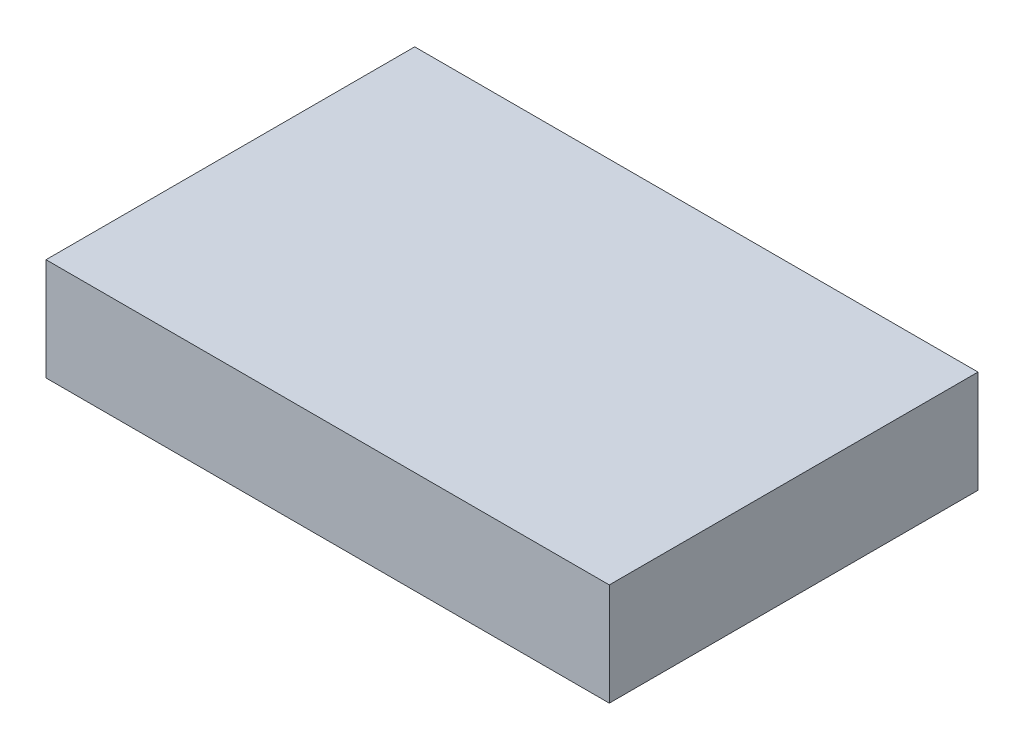
ISO-10303-21;
HEADER;
FILE_DESCRIPTION(('STEP AP214'),'2;1');
FILE_NAME('part.step','',(''),(''),'','','');
FILE_SCHEMA(('AUTOMOTIVE_DESIGN { 1 0 10303 214 1 1 1 1 }'));
ENDSEC;
DATA;
#1=APPLICATION_CONTEXT('core data for automotive mechanical design processes');
#2=APPLICATION_PROTOCOL_DEFINITION('international standard','automotive_design',2000,#1);
#3=PRODUCT_CONTEXT('',#1,'mechanical');
#4=PRODUCT('Part','Part','',(#3));
#5=PRODUCT_RELATED_PRODUCT_CATEGORY('part','',(#4));
#6=PRODUCT_DEFINITION_FORMATION('','',#4);
#7=PRODUCT_DEFINITION_CONTEXT('part definition',#1,'design');
#8=PRODUCT_DEFINITION('design','',#6,#7);
#9=PRODUCT_DEFINITION_SHAPE('','',#8);
#10=(LENGTH_UNIT() NAMED_UNIT(*) SI_UNIT(.MILLI.,.METRE.));
#11=(NAMED_UNIT(*) PLANE_ANGLE_UNIT() SI_UNIT($,.RADIAN.));
#12=(NAMED_UNIT(*) SI_UNIT($,.STERADIAN.) SOLID_ANGLE_UNIT());
#13=UNCERTAINTY_MEASURE_WITH_UNIT(LENGTH_MEASURE(1.E-05),#10,'distance_accuracy_value','');
#14=(GEOMETRIC_REPRESENTATION_CONTEXT(3) GLOBAL_UNCERTAINTY_ASSIGNED_CONTEXT((#13)) GLOBAL_UNIT_ASSIGNED_CONTEXT((#10,
#11,#12)) REPRESENTATION_CONTEXT('',''));
#15=CARTESIAN_POINT('',(0.,0.,0.));
#16=DIRECTION('',(0.,0.,1.));
#17=DIRECTION('',(1.,0.,0.));
#18=AXIS2_PLACEMENT_3D('',#15,#16,#17);
#19=CARTESIAN_POINT('',(55.,20.,-36.));
#20=DIRECTION('',(-1.,0.,0.));
#21=DIRECTION('',(0.,0.,1.));
#22=AXIS2_PLACEMENT_3D('',#19,#20,#21);
#23=PLANE('',#22);
#24=DIRECTION('',(0.,0.,-1.));
#25=VECTOR('',#24,1.);
#26=CARTESIAN_POINT('',(55.,0.,-36.));
#27=LINE('',#26,#25);
#28=CARTESIAN_POINT('',(55.,0.,36.));
#29=VERTEX_POINT('',#28);
#30=CARTESIAN_POINT('',(55.,0.,-36.));
#31=VERTEX_POINT('',#30);
#32=EDGE_CURVE('E98',#29,#31,#27,.T.);
#33=ORIENTED_EDGE('',*,*,#32,.T.);
#34=DIRECTION('',(0.,-1.,0.));
#35=VECTOR('',#34,1.);
#36=CARTESIAN_POINT('',(55.,20.,-36.));
#37=LINE('',#36,#35);
#38=CARTESIAN_POINT('',(55.,20.,-36.));
#39=VERTEX_POINT('',#38);
#40=EDGE_CURVE('E11',#39,#31,#37,.T.);
#41=ORIENTED_EDGE('',*,*,#40,.F.);
#42=DIRECTION('',(0.,0.,-1.));
#43=VECTOR('',#42,1.);
#44=CARTESIAN_POINT('',(55.,20.,-36.));
#45=LINE('',#44,#43);
#46=CARTESIAN_POINT('',(55.,20.,36.));
#47=VERTEX_POINT('',#46);
#48=EDGE_CURVE('E86',#47,#39,#45,.T.);
#49=ORIENTED_EDGE('',*,*,#48,.F.);
#50=DIRECTION('',(0.,-1.,0.));
#51=VECTOR('',#50,1.);
#52=CARTESIAN_POINT('',(55.,20.,36.));
#53=LINE('',#52,#51);
#54=EDGE_CURVE('E94',#47,#29,#53,.T.);
#55=ORIENTED_EDGE('',*,*,#54,.T.);
#56=EDGE_LOOP('',(#33,#41,#49,#55));
#57=FACE_BOUND('',#56,.T.);
#58=ADVANCED_FACE('F35',(#57),#23,.F.);
#59=CARTESIAN_POINT('',(-55.,20.,-36.));
#60=DIRECTION('',(0.,0.,1.));
#61=DIRECTION('',(1.,0.,0.));
#62=AXIS2_PLACEMENT_3D('',#59,#60,#61);
#63=PLANE('',#62);
#64=DIRECTION('',(-1.,0.,0.));
#65=VECTOR('',#64,1.);
#66=CARTESIAN_POINT('',(-55.,0.,-36.));
#67=LINE('',#66,#65);
#68=CARTESIAN_POINT('',(-55.,0.,-36.));
#69=VERTEX_POINT('',#68);
#70=EDGE_CURVE('E90',#31,#69,#67,.T.);
#71=ORIENTED_EDGE('',*,*,#70,.T.);
#72=DIRECTION('',(0.,-1.,0.));
#73=VECTOR('',#72,1.);
#74=CARTESIAN_POINT('',(-55.,20.,-36.));
#75=LINE('',#74,#73);
#76=CARTESIAN_POINT('',(-55.,20.,-36.));
#77=VERTEX_POINT('',#76);
#78=EDGE_CURVE('E43',#77,#69,#75,.T.);
#79=ORIENTED_EDGE('',*,*,#78,.F.);
#80=DIRECTION('',(-1.,0.,0.));
#81=VECTOR('',#80,1.);
#82=CARTESIAN_POINT('',(-55.,20.,-36.));
#83=LINE('',#82,#81);
#84=EDGE_CURVE('E81',#39,#77,#83,.T.);
#85=ORIENTED_EDGE('',*,*,#84,.F.);
#86=ORIENTED_EDGE('',*,*,#40,.T.);
#87=EDGE_LOOP('',(#71,#79,#85,#86));
#88=FACE_BOUND('',#87,.T.);
#89=ADVANCED_FACE('F89',(#88),#63,.F.);
#90=CARTESIAN_POINT('',(-55.,20.,-36.));
#91=DIRECTION('',(1.,0.,0.));
#92=DIRECTION('',(0.,0.,-1.));
#93=AXIS2_PLACEMENT_3D('',#90,#91,#92);
#94=PLANE('',#93);
#95=DIRECTION('',(0.,0.,1.));
#96=VECTOR('',#95,1.);
#97=CARTESIAN_POINT('',(-55.,0.,-36.));
#98=LINE('',#97,#96);
#99=CARTESIAN_POINT('',(-55.,0.,36.));
#100=VERTEX_POINT('',#99);
#101=EDGE_CURVE('E68',#69,#100,#98,.T.);
#102=ORIENTED_EDGE('',*,*,#101,.T.);
#103=DIRECTION('',(0.,-1.,0.));
#104=VECTOR('',#103,1.);
#105=CARTESIAN_POINT('',(-55.,20.,36.));
#106=LINE('',#105,#104);
#107=CARTESIAN_POINT('',(-55.,20.,36.));
#108=VERTEX_POINT('',#107);
#109=EDGE_CURVE('E91',#108,#100,#106,.T.);
#110=ORIENTED_EDGE('',*,*,#109,.F.);
#111=DIRECTION('',(0.,0.,1.));
#112=VECTOR('',#111,1.);
#113=CARTESIAN_POINT('',(-55.,20.,-36.));
#114=LINE('',#113,#112);
#115=EDGE_CURVE('E84',#77,#108,#114,.T.);
#116=ORIENTED_EDGE('',*,*,#115,.F.);
#117=ORIENTED_EDGE('',*,*,#78,.T.);
#118=EDGE_LOOP('',(#102,#110,#116,#117));
#119=FACE_BOUND('',#118,.T.);
#120=ADVANCED_FACE('F92',(#119),#94,.F.);
#121=CARTESIAN_POINT('',(-55.,20.,36.));
#122=DIRECTION('',(0.,0.,-1.));
#123=DIRECTION('',(-1.,0.,0.));
#124=AXIS2_PLACEMENT_3D('',#121,#122,#123);
#125=PLANE('',#124);
#126=DIRECTION('',(1.,0.,0.));
#127=VECTOR('',#126,1.);
#128=CARTESIAN_POINT('',(-55.,0.,36.));
#129=LINE('',#128,#127);
#130=EDGE_CURVE('E74',#100,#29,#129,.T.);
#131=ORIENTED_EDGE('',*,*,#130,.T.);
#132=ORIENTED_EDGE('',*,*,#54,.F.);
#133=DIRECTION('',(1.,0.,0.));
#134=VECTOR('',#133,1.);
#135=CARTESIAN_POINT('',(-55.,20.,36.));
#136=LINE('',#135,#134);
#137=EDGE_CURVE('E51',#108,#47,#136,.T.);
#138=ORIENTED_EDGE('',*,*,#137,.F.);
#139=ORIENTED_EDGE('',*,*,#109,.T.);
#140=EDGE_LOOP('',(#131,#132,#138,#139));
#141=FACE_BOUND('',#140,.T.);
#142=ADVANCED_FACE('F105',(#141),#125,.F.);
#143=CARTESIAN_POINT('',(0.,20.,0.));
#144=DIRECTION('',(0.,1.,0.));
#145=DIRECTION('',(0.,0.,1.));
#146=AXIS2_PLACEMENT_3D('',#143,#144,#145);
#147=PLANE('',#146);
#148=ORIENTED_EDGE('',*,*,#48,.T.);
#149=ORIENTED_EDGE('',*,*,#84,.T.);
#150=ORIENTED_EDGE('',*,*,#115,.T.);
#151=ORIENTED_EDGE('',*,*,#137,.T.);
#152=EDGE_LOOP('',(#148,#149,#150,#151));
#153=FACE_BOUND('',#152,.T.);
#154=ADVANCED_FACE('F82',(#153),#147,.T.);
#155=CARTESIAN_POINT('',(0.,0.,0.));
#156=DIRECTION('',(0.,1.,0.));
#157=DIRECTION('',(0.,0.,1.));
#158=AXIS2_PLACEMENT_3D('',#155,#156,#157);
#159=PLANE('',#158);
#160=ORIENTED_EDGE('',*,*,#32,.F.);
#161=ORIENTED_EDGE('',*,*,#130,.F.);
#162=ORIENTED_EDGE('',*,*,#101,.F.);
#163=ORIENTED_EDGE('',*,*,#70,.F.);
#164=EDGE_LOOP('',(#160,#161,#162,#163));
#165=FACE_BOUND('',#164,.T.);
#166=ADVANCED_FACE('F108',(#165),#159,.F.);
#167=CLOSED_SHELL('',(#58,#89,#120,#142,#154,#166));
#168=MANIFOLD_SOLID_BREP('B2',#167);
#169=ADVANCED_BREP_SHAPE_REPRESENTATION('',(#18,#168),#14);
#170=SHAPE_DEFINITION_REPRESENTATION(#9,#169);
ENDSEC;
END-ISO-10303-21;
